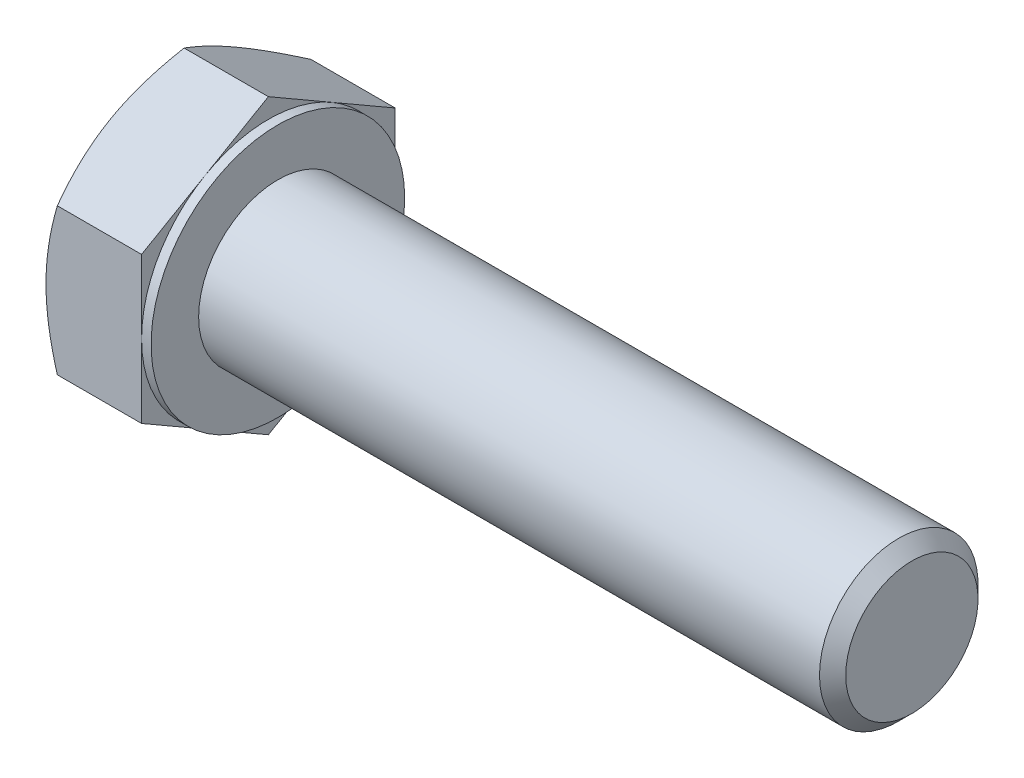
ISO-10303-21;
HEADER;
FILE_DESCRIPTION(('STEP AP214'),'2;1');
FILE_NAME('part.step','',(''),(''),'','','');
FILE_SCHEMA(('AUTOMOTIVE_DESIGN { 1 0 10303 214 1 1 1 1 }'));
ENDSEC;
DATA;
#1=APPLICATION_CONTEXT('core data for automotive mechanical design processes');
#2=APPLICATION_PROTOCOL_DEFINITION('international standard','automotive_design',2000,#1);
#3=PRODUCT_CONTEXT('',#1,'mechanical');
#4=PRODUCT('Part','Part','',(#3));
#5=PRODUCT_RELATED_PRODUCT_CATEGORY('part','',(#4));
#6=PRODUCT_DEFINITION_FORMATION('','',#4);
#7=PRODUCT_DEFINITION_CONTEXT('part definition',#1,'design');
#8=PRODUCT_DEFINITION('design','',#6,#7);
#9=PRODUCT_DEFINITION_SHAPE('','',#8);
#10=(LENGTH_UNIT() NAMED_UNIT(*) SI_UNIT(.MILLI.,.METRE.));
#11=(NAMED_UNIT(*) PLANE_ANGLE_UNIT() SI_UNIT($,.RADIAN.));
#12=(NAMED_UNIT(*) SI_UNIT($,.STERADIAN.) SOLID_ANGLE_UNIT());
#13=UNCERTAINTY_MEASURE_WITH_UNIT(LENGTH_MEASURE(1.E-05),#10,'distance_accuracy_value','');
#14=(GEOMETRIC_REPRESENTATION_CONTEXT(3) GLOBAL_UNCERTAINTY_ASSIGNED_CONTEXT((#13)) GLOBAL_UNIT_ASSIGNED_CONTEXT((#10,
#11,#12)) REPRESENTATION_CONTEXT('',''));
#15=CARTESIAN_POINT('',(0.,0.,0.));
#16=DIRECTION('',(0.,0.,1.));
#17=DIRECTION('',(1.,0.,0.));
#18=AXIS2_PLACEMENT_3D('',#15,#16,#17);
#19=CARTESIAN_POINT('',(6.63,9.23760430703402,0.));
#20=DIRECTION('',(1.,0.,0.));
#21=DIRECTION('',(0.,0.,-1.));
#22=AXIS2_PLACEMENT_3D('',#19,#20,#21);
#23=PLANE('',#22);
#24=CARTESIAN_POINT('',(6.63,0.,0.));
#25=DIRECTION('',(1.,0.,0.));
#26=DIRECTION('',(0.,0.,-1.));
#27=AXIS2_PLACEMENT_3D('',#24,#25,#26);
#28=CIRCLE('',#27,5.);
#29=CARTESIAN_POINT('',(6.63,0.,-5.));
#30=VERTEX_POINT('',#29);
#31=EDGE_CURVE('E280',#30,#30,#28,.F.);
#32=ORIENTED_EDGE('',*,*,#31,.T.);
#33=EDGE_LOOP('',(#32));
#34=FACE_BOUND('',#33,.T.);
#35=CARTESIAN_POINT('',(6.63,0.,0.));
#36=DIRECTION('',(1.,0.,0.));
#37=DIRECTION('',(0.,0.,-1.));
#38=AXIS2_PLACEMENT_3D('',#35,#36,#37);
#39=CIRCLE('',#38,8.);
#40=CARTESIAN_POINT('',(6.63,0.,-8.));
#41=VERTEX_POINT('',#40);
#42=EDGE_CURVE('E299',#41,#41,#39,.T.);
#43=ORIENTED_EDGE('',*,*,#42,.T.);
#44=EDGE_LOOP('',(#43));
#45=FACE_BOUND('',#44,.T.);
#46=ADVANCED_FACE('F36',(#34,#45),#23,.T.);
#47=CARTESIAN_POINT('',(0.,0.,0.));
#48=DIRECTION('',(-1.,0.,0.));
#49=DIRECTION('',(0.,0.,1.));
#50=AXIS2_PLACEMENT_3D('',#47,#48,#49);
#51=CYLINDRICAL_SURFACE('',#50,5.);
#52=ORIENTED_EDGE('',*,*,#31,.F.);
#53=EDGE_LOOP('',(#52));
#54=FACE_BOUND('',#53,.T.);
#55=CARTESIAN_POINT('',(45.802,0.,0.));
#56=DIRECTION('',(-1.,0.,0.));
#57=DIRECTION('',(0.,0.,1.));
#58=AXIS2_PLACEMENT_3D('',#55,#56,#57);
#59=CIRCLE('',#58,5.);
#60=CARTESIAN_POINT('',(45.802,0.,5.));
#61=VERTEX_POINT('',#60);
#62=EDGE_CURVE('E277',#61,#61,#59,.T.);
#63=ORIENTED_EDGE('',*,*,#62,.T.);
#64=EDGE_LOOP('',(#63));
#65=FACE_BOUND('',#64,.T.);
#66=ADVANCED_FACE('F251',(#54,#65),#51,.T.);
#67=CARTESIAN_POINT('',(46.63,0.,0.));
#68=DIRECTION('',(-1.,0.,0.));
#69=DIRECTION('',(0.,0.,1.));
#70=AXIS2_PLACEMENT_3D('',#67,#68,#69);
#71=CONICAL_SURFACE('',#70,4.172,0.785398163397448);
#72=ORIENTED_EDGE('',*,*,#62,.F.);
#73=EDGE_LOOP('',(#72));
#74=FACE_BOUND('',#73,.T.);
#75=CARTESIAN_POINT('',(46.63,0.,0.));
#76=DIRECTION('',(-1.,0.,0.));
#77=DIRECTION('',(0.,0.,1.));
#78=AXIS2_PLACEMENT_3D('',#75,#76,#77);
#79=CIRCLE('',#78,4.172);
#80=CARTESIAN_POINT('',(46.63,0.,4.172));
#81=VERTEX_POINT('',#80);
#82=EDGE_CURVE('E275',#81,#81,#79,.T.);
#83=ORIENTED_EDGE('',*,*,#82,.T.);
#84=EDGE_LOOP('',(#83));
#85=FACE_BOUND('',#84,.T.);
#86=ADVANCED_FACE('F256',(#74,#85),#71,.T.);
#87=CARTESIAN_POINT('',(46.63,0.,0.));
#88=DIRECTION('',(-1.,0.,0.));
#89=DIRECTION('',(0.,0.,1.));
#90=AXIS2_PLACEMENT_3D('',#87,#88,#89);
#91=PLANE('',#90);
#92=ORIENTED_EDGE('',*,*,#82,.F.);
#93=EDGE_LOOP('',(#92));
#94=FACE_BOUND('',#93,.T.);
#95=ADVANCED_FACE('F263',(#94),#91,.F.);
#96=CARTESIAN_POINT('',(6.03,8.,0.));
#97=DIRECTION('',(1.,0.,0.));
#98=DIRECTION('',(0.,0.,-1.));
#99=AXIS2_PLACEMENT_3D('',#96,#97,#98);
#100=PLANE('',#99);
#101=DIRECTION('',(0.,0.500000000000001,0.866025403784438));
#102=VECTOR('',#101,1.);
#103=CARTESIAN_POINT('',(6.03,4.618802153517,-8.));
#104=LINE('',#103,#102);
#105=CARTESIAN_POINT('',(6.03,4.618802153517,-8.));
#106=VERTEX_POINT('',#105);
#107=CARTESIAN_POINT('',(6.03,6.92820323027551,-4.00000000000001));
#108=VERTEX_POINT('',#107);
#109=EDGE_CURVE('E169',#106,#108,#104,.T.);
#110=ORIENTED_EDGE('',*,*,#109,.T.);
#111=CARTESIAN_POINT('',(6.03,0.,0.));
#112=DIRECTION('',(-1.,0.,0.));
#113=DIRECTION('',(0.,0.,1.));
#114=AXIS2_PLACEMENT_3D('',#111,#112,#113);
#115=CIRCLE('',#114,8.);
#116=CARTESIAN_POINT('',(6.03,0.,-8.));
#117=VERTEX_POINT('',#116);
#118=EDGE_CURVE('E52',#108,#117,#115,.T.);
#119=ORIENTED_EDGE('',*,*,#118,.T.);
#120=DIRECTION('',(0.,1.,0.));
#121=VECTOR('',#120,1.);
#122=CARTESIAN_POINT('',(6.03,4.618802153517,-8.));
#123=LINE('',#122,#121);
#124=EDGE_CURVE('E41',#117,#106,#123,.T.);
#125=ORIENTED_EDGE('',*,*,#124,.T.);
#126=EDGE_LOOP('',(#110,#119,#125));
#127=FACE_BOUND('',#126,.T.);
#128=ADVANCED_FACE('F266',(#127),#100,.T.);
#129=CARTESIAN_POINT('',(6.03,9.23760430703402,0.));
#130=VERTEX_POINT('',#129);
#131=EDGE_CURVE('E167',#108,#130,#104,.T.);
#132=ORIENTED_EDGE('',*,*,#131,.T.);
#133=DIRECTION('',(0.,-0.500000000000001,0.866025403784438));
#134=VECTOR('',#133,1.);
#135=CARTESIAN_POINT('',(6.03,9.23760430703402,0.));
#136=LINE('',#135,#134);
#137=CARTESIAN_POINT('',(6.03,6.92820323027551,4.00000000000001));
#138=VERTEX_POINT('',#137);
#139=EDGE_CURVE('E166',#130,#138,#136,.T.);
#140=ORIENTED_EDGE('',*,*,#139,.T.);
#141=EDGE_CURVE('E155',#138,#108,#115,.T.);
#142=ORIENTED_EDGE('',*,*,#141,.T.);
#143=EDGE_LOOP('',(#132,#140,#142));
#144=FACE_BOUND('',#143,.T.);
#145=ADVANCED_FACE('F271',(#144),#100,.T.);
#146=CARTESIAN_POINT('',(6.03,4.618802153517,8.));
#147=VERTEX_POINT('',#146);
#148=EDGE_CURVE('E134',#138,#147,#136,.T.);
#149=ORIENTED_EDGE('',*,*,#148,.T.);
#150=DIRECTION('',(0.,-1.,0.));
#151=VECTOR('',#150,1.);
#152=CARTESIAN_POINT('',(6.03,4.618802153517,8.));
#153=LINE('',#152,#151);
#154=CARTESIAN_POINT('',(6.03,0.,8.));
#155=VERTEX_POINT('',#154);
#156=EDGE_CURVE('E128',#147,#155,#153,.T.);
#157=ORIENTED_EDGE('',*,*,#156,.T.);
#158=EDGE_CURVE('E132',#155,#138,#115,.T.);
#159=ORIENTED_EDGE('',*,*,#158,.T.);
#160=EDGE_LOOP('',(#149,#157,#159));
#161=FACE_BOUND('',#160,.T.);
#162=ADVANCED_FACE('F130',(#161),#100,.T.);
#163=CARTESIAN_POINT('',(6.03,-4.61880215351701,8.));
#164=VERTEX_POINT('',#163);
#165=EDGE_CURVE('E138',#155,#164,#153,.T.);
#166=ORIENTED_EDGE('',*,*,#165,.T.);
#167=DIRECTION('',(0.,-0.500000000000001,-0.866025403784438));
#168=VECTOR('',#167,1.);
#169=CARTESIAN_POINT('',(6.03,-9.23760430703403,0.));
#170=LINE('',#169,#168);
#171=CARTESIAN_POINT('',(6.03,-6.92820323027551,4.00000000000001));
#172=VERTEX_POINT('',#171);
#173=EDGE_CURVE('E145',#164,#172,#170,.T.);
#174=ORIENTED_EDGE('',*,*,#173,.T.);
#175=EDGE_CURVE('E142',#172,#155,#115,.T.);
#176=ORIENTED_EDGE('',*,*,#175,.T.);
#177=EDGE_LOOP('',(#166,#174,#176));
#178=FACE_BOUND('',#177,.T.);
#179=ADVANCED_FACE('F143',(#178),#100,.T.);
#180=CARTESIAN_POINT('',(6.03,-9.23760430703403,0.));
#181=VERTEX_POINT('',#180);
#182=EDGE_CURVE('E161',#172,#181,#170,.T.);
#183=ORIENTED_EDGE('',*,*,#182,.T.);
#184=DIRECTION('',(0.,0.500000000000001,-0.866025403784438));
#185=VECTOR('',#184,1.);
#186=CARTESIAN_POINT('',(6.03,-4.61880215351701,-8.));
#187=LINE('',#186,#185);
#188=CARTESIAN_POINT('',(6.03,-6.92820323027551,-4.));
#189=VERTEX_POINT('',#188);
#190=EDGE_CURVE('E335',#181,#189,#187,.T.);
#191=ORIENTED_EDGE('',*,*,#190,.T.);
#192=EDGE_CURVE('E149',#189,#172,#115,.T.);
#193=ORIENTED_EDGE('',*,*,#192,.T.);
#194=EDGE_LOOP('',(#183,#191,#193));
#195=FACE_BOUND('',#194,.T.);
#196=ADVANCED_FACE('F340',(#195),#100,.T.);
#197=CARTESIAN_POINT('',(6.03,-4.61880215351701,-8.));
#198=VERTEX_POINT('',#197);
#199=EDGE_CURVE('E156',#189,#198,#187,.T.);
#200=ORIENTED_EDGE('',*,*,#199,.T.);
#201=EDGE_CURVE('E11',#198,#117,#123,.T.);
#202=ORIENTED_EDGE('',*,*,#201,.T.);
#203=EDGE_CURVE('E353',#117,#189,#115,.T.);
#204=ORIENTED_EDGE('',*,*,#203,.T.);
#205=EDGE_LOOP('',(#200,#202,#204));
#206=FACE_BOUND('',#205,.T.);
#207=ADVANCED_FACE('F272',(#206),#100,.T.);
#208=CARTESIAN_POINT('',(0.,0.,0.));
#209=DIRECTION('',(-1.,0.,0.));
#210=DIRECTION('',(0.,0.,1.));
#211=AXIS2_PLACEMENT_3D('',#208,#209,#210);
#212=CYLINDRICAL_SURFACE('',#211,8.);
#213=ORIENTED_EDGE('',*,*,#118,.F.);
#214=ORIENTED_EDGE('',*,*,#141,.F.);
#215=ORIENTED_EDGE('',*,*,#158,.F.);
#216=ORIENTED_EDGE('',*,*,#175,.F.);
#217=ORIENTED_EDGE('',*,*,#192,.F.);
#218=ORIENTED_EDGE('',*,*,#203,.F.);
#219=EDGE_LOOP('',(#213,#214,#215,#216,#217,#218));
#220=FACE_BOUND('',#219,.T.);
#221=ORIENTED_EDGE('',*,*,#42,.F.);
#222=EDGE_LOOP('',(#221));
#223=FACE_BOUND('',#222,.T.);
#224=ADVANCED_FACE('F152',(#220,#223),#212,.T.);
#225=CARTESIAN_POINT('',(0.,9.23760430703402,0.));
#226=DIRECTION('',(1.,0.,0.));
#227=DIRECTION('',(0.,0.,-1.));
#228=AXIS2_PLACEMENT_3D('',#225,#226,#227);
#229=PLANE('',#228);
#230=CARTESIAN_POINT('',(0.,0.,0.));
#231=DIRECTION('',(1.,0.,0.));
#232=DIRECTION('',(0.,0.,-1.));
#233=AXIS2_PLACEMENT_3D('',#230,#231,#232);
#234=CIRCLE('',#233,8.);
#235=CARTESIAN_POINT('',(0.,0.,-8.));
#236=VERTEX_POINT('',#235);
#237=CARTESIAN_POINT('',(0.,6.92820323027551,-4.00000000000001));
#238=VERTEX_POINT('',#237);
#239=EDGE_CURVE('E298',#236,#238,#234,.T.);
#240=ORIENTED_EDGE('',*,*,#239,.F.);
#241=CARTESIAN_POINT('',(0.,-6.92820323027551,-4.));
#242=VERTEX_POINT('',#241);
#243=EDGE_CURVE('E295',#242,#236,#234,.T.);
#244=ORIENTED_EDGE('',*,*,#243,.F.);
#245=CARTESIAN_POINT('',(0.,-6.92820323027551,4.00000000000001));
#246=VERTEX_POINT('',#245);
#247=EDGE_CURVE('E297',#246,#242,#234,.T.);
#248=ORIENTED_EDGE('',*,*,#247,.F.);
#249=CARTESIAN_POINT('',(0.,0.,8.));
#250=VERTEX_POINT('',#249);
#251=EDGE_CURVE('E307',#250,#246,#234,.T.);
#252=ORIENTED_EDGE('',*,*,#251,.F.);
#253=CARTESIAN_POINT('',(0.,0.,0.));
#254=DIRECTION('',(-1.,0.,0.));
#255=DIRECTION('',(0.,0.,1.));
#256=AXIS2_PLACEMENT_3D('',#253,#254,#255);
#257=CIRCLE('',#256,8.);
#258=CARTESIAN_POINT('',(0.,6.9282032302755,4.00000000000001));
#259=VERTEX_POINT('',#258);
#260=EDGE_CURVE('E170',#250,#259,#257,.T.);
#261=ORIENTED_EDGE('',*,*,#260,.T.);
#262=EDGE_CURVE('E302',#238,#259,#234,.T.);
#263=ORIENTED_EDGE('',*,*,#262,.F.);
#264=EDGE_LOOP('',(#240,#244,#248,#252,#261,#263));
#265=FACE_BOUND('',#264,.T.);
#266=ADVANCED_FACE('F201',(#265),#229,.F.);
#267=CARTESIAN_POINT('',(0.,0.,0.));
#268=DIRECTION('',(1.,0.,0.));
#269=DIRECTION('',(0.,0.,-1.));
#270=AXIS2_PLACEMENT_3D('',#267,#268,#269);
#271=CONICAL_SURFACE('',#270,8.,1.0471975511966);
#272=CARTESIAN_POINT('',(0.714597847732973,4.61868668346316,8.0002));
#273=CARTESIAN_POINT('',(0.655990714047297,4.72021302617289,7.8243512161201));
#274=CARTESIAN_POINT('',(0.60004340104729,4.82211789504564,7.64784680569386));
#275=CARTESIAN_POINT('',(0.494201005024666,5.02675523421805,7.29340453712154));
#276=CARTESIAN_POINT('',(0.444308534431066,5.12948804149869,7.11546609530729));
#277=CARTESIAN_POINT('',(0.304692797206866,5.43933133858026,6.57880176237736));
#278=CARTESIAN_POINT('',(0.225281170978369,5.64766491807818,6.21795741776428));
#279=CARTESIAN_POINT('',(0.132161646294488,5.95943209350317,5.67796082979595));
#280=CARTESIAN_POINT('',(0.105634581029124,6.06193429416807,5.50042181035672));
#281=CARTESIAN_POINT('',(0.061153174858875,6.26740224104455,5.1445408870398));
#282=CARTESIAN_POINT('',(0.0431980765145795,6.37036794548792,4.96619905550676));
#283=CARTESIAN_POINT('',(0.0163156484918648,6.57647664551585,4.60920831517641));
#284=CARTESIAN_POINT('',(0.00737807354623306,6.67961930623067,4.4305599863905));
#285=CARTESIAN_POINT('',(-0.0012776960348698,6.88599991003618,4.07309829490262));
#286=CARTESIAN_POINT('',(-0.000996175497149585,6.98923785008464,3.89428493746994));
#287=CARTESIAN_POINT('',(0.00814502526877654,7.18224506616975,3.5599866329831));
#288=CARTESIAN_POINT('',(0.0158896043673707,7.27202796205376,3.40447809566133));
#289=CARTESIAN_POINT('',(0.0382011348534295,7.45138347289924,3.09382523825949));
#290=CARTESIAN_POINT('',(0.0527685461381487,7.54095607327651,2.93868094344));
#291=CARTESIAN_POINT('',(0.106360690527537,7.80932710333149,2.47384868410519));
#292=CARTESIAN_POINT('',(0.155268641669144,7.98765049311728,2.16498351281828));
#293=CARTESIAN_POINT('',(0.277539403234314,8.34618890253625,1.5439767712397));
#294=CARTESIAN_POINT('',(0.351420520376,8.52635816315522,1.23191445788552));
#295=CARTESIAN_POINT('',(0.519100141254974,8.88400987687705,0.612443518305242));
#296=CARTESIAN_POINT('',(0.612859260854458,9.06149691008278,0.30502695910825));
#297=CARTESIAN_POINT('',(0.714597847732978,9.23771977708786,-0.0002000000000001));
#298=B_SPLINE_CURVE_WITH_KNOTS('',3,(#272,#273,#274,#275,#276,#277,#278,#279,#280,#281,#282,
#283,#284,#285,#286,#287,#288,#289,#290,#291,#292,#293,#294,#295,#296,#297),.UNSPECIFIED.,.F.,
.F.,(4,2,2,2,2,2,2,2,2,2,2,2,4),(0.,0.63397354372135,1.26821965714356,2.53934712434766,
3.15934343977049,3.77928496069784,4.39852133866766,5.01773858515595,5.55680239410249,
6.09590254421147,7.17487077411835,8.27776850154293,9.37850115249055),.UNSPECIFIED.);
#299=CARTESIAN_POINT('',(0.714531179816327,9.23760430703402,0.));
#300=VERTEX_POINT('',#299);
#301=EDGE_CURVE('E220',#259,#300,#298,.T.);
#302=ORIENTED_EDGE('',*,*,#301,.T.);
#303=CARTESIAN_POINT('',(0.714597847732979,9.23771977708786,0.0002));
#304=CARTESIAN_POINT('',(0.655990714047303,9.13619343437813,-0.175648783879896));
#305=CARTESIAN_POINT('',(0.600043401047295,9.03428856550538,-0.352153194306135));
#306=CARTESIAN_POINT('',(0.494201005024671,8.82965122633297,-0.70659546287846));
#307=CARTESIAN_POINT('',(0.444308534431071,8.72691841905233,-0.884533904692712));
#308=CARTESIAN_POINT('',(0.30469279720687,8.41707512197076,-1.42119823762264));
#309=CARTESIAN_POINT('',(0.225281170978371,8.20874154247285,-1.78204258223572));
#310=CARTESIAN_POINT('',(0.132161646294491,7.89697436704785,-2.32203917020405));
#311=CARTESIAN_POINT('',(0.105634581029126,7.79447216638295,-2.49957818964329));
#312=CARTESIAN_POINT('',(0.0611531748588776,7.58900421950647,-2.8554591129602));
#313=CARTESIAN_POINT('',(0.0431980765145813,7.4860385150631,-3.03380094449324));
#314=CARTESIAN_POINT('',(0.0163156484918661,7.27992981503517,-3.3907916848236));
#315=CARTESIAN_POINT('',(0.00737807354623461,7.17678715432035,-3.5694400136095));
#316=CARTESIAN_POINT('',(-0.00127769603486937,6.97040655051484,-3.92690170509738));
#317=CARTESIAN_POINT('',(-0.000996175497150483,6.86716861046638,-4.10571506253007));
#318=CARTESIAN_POINT('',(0.00814502526877518,6.67416139438127,-4.44001336701691));
#319=CARTESIAN_POINT('',(0.0158896043673699,6.58437849849726,-4.59552190433867));
#320=CARTESIAN_POINT('',(0.0382011348534286,6.40502298765178,-4.90617476174051));
#321=CARTESIAN_POINT('',(0.0527685461381473,6.31545038727451,-5.06131905656));
#322=CARTESIAN_POINT('',(0.106360690527535,6.04707935721953,-5.52615131589482));
#323=CARTESIAN_POINT('',(0.155268641669142,5.86875596743374,-5.83501648718172));
#324=CARTESIAN_POINT('',(0.277539403234311,5.51021755801478,-6.4560232287603));
#325=CARTESIAN_POINT('',(0.351420520375997,5.3300482973958,-6.76808554211448));
#326=CARTESIAN_POINT('',(0.51910014125497,4.97239658367398,-7.38755648169476));
#327=CARTESIAN_POINT('',(0.612859260854453,4.79490955046824,-7.69497304089175));
#328=CARTESIAN_POINT('',(0.714597847732973,4.61868668346316,-8.0002));
#329=B_SPLINE_CURVE_WITH_KNOTS('',3,(#303,#304,#305,#306,#307,#308,#309,#310,#311,#312,#313,
#314,#315,#316,#317,#318,#319,#320,#321,#322,#323,#324,#325,#326,#327,#328),.UNSPECIFIED.,.F.,
.F.,(4,2,2,2,2,2,2,2,2,2,2,2,4),(0.,0.633973543721351,1.26821965714356,2.53934712434766,
3.15934343977049,3.77928496069784,4.39852133866766,5.01773858515596,5.55680239410249,
6.09590254421148,7.17487077411835,8.27776850154293,9.37850115249055),.UNSPECIFIED.);
#330=EDGE_CURVE('E60',#300,#238,#329,.T.);
#331=ORIENTED_EDGE('',*,*,#330,.T.);
#332=ORIENTED_EDGE('',*,*,#262,.T.);
#333=EDGE_LOOP('',(#302,#331,#332));
#334=FACE_BOUND('',#333,.T.);
#335=ADVANCED_FACE('F349',(#334),#271,.T.);
#336=CARTESIAN_POINT('',(4.0249059167733,-12.6546855991449,8.));
#337=CARTESIAN_POINT('',(3.85338488067433,-12.3031246943084,8.));
#338=CARTESIAN_POINT('',(3.6834382004866,-11.9507829330126,8.));
#339=CARTESIAN_POINT('',(3.34757428373754,-11.2441233421334,8.));
#340=CARTESIAN_POINT('',(3.18165763687251,-10.8898052325765,8.));
#341=CARTESIAN_POINT('',(2.8539519485588,-10.177068949224,8.));
#342=CARTESIAN_POINT('',(2.69218825446259,-9.81863908249931,8.));
#343=CARTESIAN_POINT('',(2.37495727163404,-9.09901413787101,8.));
#344=CARTESIAN_POINT('',(2.21948970117941,-8.73781918455396,8.));
#345=CARTESIAN_POINT('',(1.911249099453,-7.99950052196692,8.));
#346=CARTESIAN_POINT('',(1.75875676876379,-7.62225899821522,8.));
#347=CARTESIAN_POINT('',(1.46472411543647,-6.86345577325908,8.));
#348=CARTESIAN_POINT('',(1.32318498677801,-6.48189360625494,8.));
#349=CARTESIAN_POINT('',(1.0545943266276,-5.71447512846895,8.));
#350=CARTESIAN_POINT('',(0.927515477435015,-5.32862847865213,8.));
#351=CARTESIAN_POINT('',(0.69175721197265,-4.55141880683298,8.));
#352=CARTESIAN_POINT('',(0.583072255498525,-4.16005748444889,8.));
#353=CARTESIAN_POINT('',(0.38975037705901,-3.37376378378106,8.));
#354=CARTESIAN_POINT('',(0.30497372409415,-2.97886668689222,8.));
#355=CARTESIAN_POINT('',(0.19927520003407,-2.38273452721077,8.));
#356=CARTESIAN_POINT('',(0.167618755452532,-2.18337977546989,8.));
#357=CARTESIAN_POINT('',(0.112075358367338,-1.78359737346043,8.));
#358=CARTESIAN_POINT('',(0.0881876497104349,-1.58316982954116,8.));
#359=CARTESIAN_POINT('',(0.048970697402874,-1.18423541636502,8.));
#360=CARTESIAN_POINT('',(0.0335291727837695,-0.985739633099701,8.));
#361=CARTESIAN_POINT('',(0.011062971420028,-0.588272081696584,8.));
#362=CARTESIAN_POINT('',(0.00403814809138642,-0.389300321908793,8.));
#363=CARTESIAN_POINT('',(-0.00142584062308302,0.00876221739738226,8.));
#364=CARTESIAN_POINT('',(0.000134957775689094,0.207852996410185,8.));
#365=CARTESIAN_POINT('',(0.0118014221261086,0.605786210981723,8.));
#366=CARTESIAN_POINT('',(0.0219074678573634,0.804628635109369,8.));
#367=CARTESIAN_POINT('',(0.0557165381587494,1.27520492278816,8.));
#368=CARTESIAN_POINT('',(0.0830672705335621,1.54668292394839,8.));
#369=CARTESIAN_POINT('',(0.152259239797329,2.08777093274817,8.));
#370=CARTESIAN_POINT('',(0.194102245476499,2.35738070827078,8.));
#371=CARTESIAN_POINT('',(0.339163191030428,3.16301775718137,8.));
#372=CARTESIAN_POINT('',(0.461891297316743,3.6955868926657,8.));
#373=CARTESIAN_POINT('',(0.676586598475546,4.49226054421557,8.));
#374=CARTESIAN_POINT('',(0.754301853574808,4.76044513184217,8.));
#375=CARTESIAN_POINT('',(0.918275620129024,5.29421545251858,8.));
#376=CARTESIAN_POINT('',(1.00453419425134,5.5598011664893,8.));
#377=CARTESIAN_POINT('',(1.18417203692079,6.08844838170895,8.));
#378=CARTESIAN_POINT('',(1.27754932022058,6.35151056384122,8.));
#379=CARTESIAN_POINT('',(1.47027925064866,6.87542422157423,8.));
#380=CARTESIAN_POINT('',(1.5696317881954,7.13627573761683,8.));
#381=CARTESIAN_POINT('',(1.83061788769923,7.80218876251026,8.));
#382=CARTESIAN_POINT('',(1.99585031155407,8.20583801515886,8.));
#383=CARTESIAN_POINT('',(2.33560644018457,9.0092209168922,8.));
#384=CARTESIAN_POINT('',(2.510130999083,9.40895420201323,8.));
#385=CARTESIAN_POINT('',(2.86641485367069,10.2053302526422,8.));
#386=CARTESIAN_POINT('',(3.04817649814071,10.6019719640146,8.));
#387=CARTESIAN_POINT('',(3.41731475401143,11.3926098784745,8.));
#388=CARTESIAN_POINT('',(3.60469118042222,11.7866061681983,8.));
#389=CARTESIAN_POINT('',(3.98417977419137,12.5730081393898,8.));
#390=CARTESIAN_POINT('',(4.17629838528329,12.9654107050659,8.));
#391=CARTESIAN_POINT('',(4.56413461314098,13.7484335721844,8.));
#392=CARTESIAN_POINT('',(4.75985225388509,14.1390538617309,8.));
#393=CARTESIAN_POINT('',(5.15417791142117,14.9187387057041,8.));
#394=CARTESIAN_POINT('',(5.35278537700422,15.3078035392312,8.));
#395=CARTESIAN_POINT('',(5.75241278006942,16.0846929572358,8.));
#396=CARTESIAN_POINT('',(5.95343272769671,16.4725175364891,8.));
#397=CARTESIAN_POINT('',(6.5202315836378,17.559169962925,8.));
#398=CARTESIAN_POINT('',(6.88826669822291,18.2568208048589,7.99999999999999));
#399=CARTESIAN_POINT('',(7.62911646383156,19.6496204545043,7.99999999999999));
#400=CARTESIAN_POINT('',(8.00193136222298,20.3447691303174,7.99999999999999));
#401=CARTESIAN_POINT('',(8.74998840854047,21.7309493550891,7.99999999999999));
#402=CARTESIAN_POINT('',(9.12521930468555,22.4219869802512,7.99999999999999));
#403=CARTESIAN_POINT('',(9.69012626360779,23.4573861860725,7.99999999999999));
#404=CARTESIAN_POINT('',(9.8787653796288,23.8023143286788,7.99999999999999));
#405=CARTESIAN_POINT('',(10.2566598347554,24.4918322089549,7.99999999999999));
#406=CARTESIAN_POINT('',(10.4459151728861,24.836421947159,7.99999999999999));
#407=CARTESIAN_POINT('',(10.6354414476718,25.1808626447394,7.99999999999999));
#408=B_SPLINE_CURVE_WITH_KNOTS('',3,(#336,#337,#338,#339,#340,#341,#342,#343,#344,#345,#346,
#347,#348,#349,#350,#351,#352,#353,#354,#355,#356,#357,#358,#359,#360,#361,#362,#363,#364,#365,
#366,#367,#368,#369,#370,#371,#372,#373,#374,#375,#376,#377,#378,#379,#380,#381,#382,#383,#384,
#385,#386,#387,#388,#389,#390,#391,#392,#393,#394,#395,#396,#397,#398,#399,#400,#401,#402,#403,
#404,#405,#406,#407),.UNSPECIFIED.,.F.,.F.,(4,2,2,2,2,2,2,2,2,2,2,2,2,2,2,2,2,2,2,2,2,2,2,2,2,2,
2,2,2,2,2,2,2,2,2,4),(0.,1.17352534459167,2.34722138373236,3.52689945532928,4.70652468335868,
5.92708318027306,7.14777454017932,8.36612013432257,9.5840981095466,10.7948027291759,
11.40023293749,12.0056041999049,12.6027191320313,13.1998236647426,13.7969256787822,
14.3940542314437,15.2121538551722,16.0303533636327,17.6675489933806,18.5051258944523,
19.3427089398139,20.180059250671,21.0173942098501,22.3257038658076,23.6341339884584,
24.9429922771239,26.2518074902209,27.5625113934848,28.8732240324076,30.1836898590194,
31.4941611984269,33.8604586198774,36.2268790025322,38.5858914656951,39.7653151283338,
40.9447369260388),.UNSPECIFIED.);
#409=CARTESIAN_POINT('',(0.714531179816321,4.618802153517,8.));
#410=VERTEX_POINT('',#409);
#411=EDGE_CURVE('E234',#250,#410,#408,.T.);
#412=ORIENTED_EDGE('',*,*,#411,.T.);
#413=EDGE_CURVE('E233',#410,#259,#298,.T.);
#414=ORIENTED_EDGE('',*,*,#413,.T.);
#415=ORIENTED_EDGE('',*,*,#260,.F.);
#416=EDGE_LOOP('',(#412,#414,#415));
#417=FACE_BOUND('',#416,.T.);
#418=ADVANCED_FACE('F345',(#417),#271,.T.);
#419=CARTESIAN_POINT('',(0.714531179816324,-4.61880215351701,8.));
#420=VERTEX_POINT('',#419);
#421=EDGE_CURVE('E278',#420,#250,#408,.T.);
#422=ORIENTED_EDGE('',*,*,#421,.T.);
#423=ORIENTED_EDGE('',*,*,#251,.T.);
#424=CARTESIAN_POINT('',(0.714597847732982,-9.23771977708786,-0.000200000000000075));
#425=CARTESIAN_POINT('',(0.655990714047307,-9.13619343437814,0.175648783879896));
#426=CARTESIAN_POINT('',(0.600043401047299,-9.03428856550539,0.352153194306135));
#427=CARTESIAN_POINT('',(0.494201005024675,-8.82965122633298,0.706595462878461));
#428=CARTESIAN_POINT('',(0.444308534431075,-8.72691841905234,0.884533904692713));
#429=CARTESIAN_POINT('',(0.304692797206873,-8.41707512197077,1.42119823762265));
#430=CARTESIAN_POINT('',(0.225281170978374,-8.20874154247285,1.78204258223573));
#431=CARTESIAN_POINT('',(0.132161646294494,-7.89697436704786,2.32203917020405));
#432=CARTESIAN_POINT('',(0.10563458102913,-7.79447216638295,2.49957818964329));
#433=CARTESIAN_POINT('',(0.0611531748588812,-7.58900421950648,2.8554591129602));
#434=CARTESIAN_POINT('',(0.0431980765145852,-7.48603851506311,3.03380094449324));
#435=CARTESIAN_POINT('',(0.0163156484918699,-7.27992981503517,3.3907916848236));
#436=CARTESIAN_POINT('',(0.00737807354623799,-7.17678715432035,3.56944001360951));
#437=CARTESIAN_POINT('',(-0.00127769603486573,-6.97040655051484,3.92690170509739));
#438=CARTESIAN_POINT('',(-0.000996175497146175,-6.86716861046638,4.10571506253007));
#439=CARTESIAN_POINT('',(0.00814502526877916,-6.67416139438127,4.44001336701691));
#440=CARTESIAN_POINT('',(0.0158896043673731,-6.58437849849726,4.59552190433868));
#441=CARTESIAN_POINT('',(0.0382011348534317,-6.40502298765179,4.90617476174052));
#442=CARTESIAN_POINT('',(0.0527685461381509,-6.31545038727452,5.06131905656));
#443=CARTESIAN_POINT('',(0.106360690527539,-6.04707935721954,5.52615131589482));
#444=CARTESIAN_POINT('',(0.155268641669146,-5.86875596743375,5.83501648718172));
#445=CARTESIAN_POINT('',(0.277539403234314,-5.51021755801478,6.4560232287603));
#446=CARTESIAN_POINT('',(0.351420520375999,-5.33004829739581,6.76808554211448));
#447=CARTESIAN_POINT('',(0.519100141254971,-4.97239658367398,7.38755648169476));
#448=CARTESIAN_POINT('',(0.612859260854455,-4.79490955046825,7.69497304089175));
#449=CARTESIAN_POINT('',(0.714597847732975,-4.61868668346317,8.0002));
#450=B_SPLINE_CURVE_WITH_KNOTS('',3,(#424,#425,#426,#427,#428,#429,#430,#431,#432,#433,#434,
#435,#436,#437,#438,#439,#440,#441,#442,#443,#444,#445,#446,#447,#448,#449),.UNSPECIFIED.,.F.,
.F.,(4,2,2,2,2,2,2,2,2,2,2,2,4),(0.,0.633973543721352,1.26821965714356,2.53934712434766,
3.15934343977049,3.77928496069784,4.39852133866767,5.01773858515596,5.5568023941025,
6.09590254421149,7.17487077411835,8.27776850154293,9.37850115249055),.UNSPECIFIED.);
#451=EDGE_CURVE('E222',#246,#420,#450,.T.);
#452=ORIENTED_EDGE('',*,*,#451,.T.);
#453=EDGE_LOOP('',(#422,#423,#452));
#454=FACE_BOUND('',#453,.T.);
#455=ADVANCED_FACE('F190',(#454),#271,.T.);
#456=CARTESIAN_POINT('',(0.714531179816331,-9.23760430703403,0.));
#457=VERTEX_POINT('',#456);
#458=EDGE_CURVE('E214',#457,#246,#450,.T.);
#459=ORIENTED_EDGE('',*,*,#458,.T.);
#460=ORIENTED_EDGE('',*,*,#247,.T.);
#461=CARTESIAN_POINT('',(0.714597847732977,-4.61868668346318,-8.0002));
#462=CARTESIAN_POINT('',(0.655990714047301,-4.7202130261729,-7.8243512161201));
#463=CARTESIAN_POINT('',(0.600043401047293,-4.82211789504565,-7.64784680569387));
#464=CARTESIAN_POINT('',(0.49420100502467,-5.02675523421806,-7.29340453712154));
#465=CARTESIAN_POINT('',(0.44430853443107,-5.1294880414987,-7.11546609530729));
#466=CARTESIAN_POINT('',(0.304692797206871,-5.43933133858027,-6.57880176237736));
#467=CARTESIAN_POINT('',(0.225281170978372,-5.64766491807818,-6.21795741776428));
#468=CARTESIAN_POINT('',(0.132161646294493,-5.95943209350318,-5.67796082979595));
#469=CARTESIAN_POINT('',(0.105634581029129,-6.06193429416808,-5.50042181035671));
#470=CARTESIAN_POINT('',(0.0611531748588803,-6.26740224104456,-5.1445408870398));
#471=CARTESIAN_POINT('',(0.0431980765145842,-6.37036794548793,-4.96619905550676));
#472=CARTESIAN_POINT('',(0.0163156484918691,-6.57647664551586,-4.60920831517641));
#473=CARTESIAN_POINT('',(0.00737807354623747,-6.67961930623068,-4.4305599863905));
#474=CARTESIAN_POINT('',(-0.00127769603486548,-6.88599991003619,-4.07309829490262));
#475=CARTESIAN_POINT('',(-0.000996175497145387,-6.98923785008465,-3.89428493746993));
#476=CARTESIAN_POINT('',(0.00814502526878082,-7.18224506616976,-3.55998663298309));
#477=CARTESIAN_POINT('',(0.0158896043673751,-7.27202796205377,-3.40447809566133));
#478=CARTESIAN_POINT('',(0.0382011348534337,-7.45138347289925,-3.09382523825949));
#479=CARTESIAN_POINT('',(0.0527685461381526,-7.54095607327652,-2.93868094344));
#480=CARTESIAN_POINT('',(0.106360690527541,-7.8093271033315,-2.47384868410518));
#481=CARTESIAN_POINT('',(0.155268641669149,-7.98765049311729,-2.16498351281828));
#482=CARTESIAN_POINT('',(0.277539403234319,-8.34618890253626,-1.5439767712397));
#483=CARTESIAN_POINT('',(0.351420520376005,-8.52635816315523,-1.23191445788552));
#484=CARTESIAN_POINT('',(0.519100141254977,-8.88400987687705,-0.612443518305239));
#485=CARTESIAN_POINT('',(0.612859260854461,-9.06149691008279,-0.305026959108248));
#486=CARTESIAN_POINT('',(0.714597847732982,-9.23771977708786,0.000200000000001359));
#487=B_SPLINE_CURVE_WITH_KNOTS('',3,(#461,#462,#463,#464,#465,#466,#467,#468,#469,#470,#471,
#472,#473,#474,#475,#476,#477,#478,#479,#480,#481,#482,#483,#484,#485,#486),.UNSPECIFIED.,.F.,
.F.,(4,2,2,2,2,2,2,2,2,2,2,2,4),(0.,0.63397354372135,1.26821965714356,2.53934712434766,
3.15934343977049,3.77928496069784,4.39852133866766,5.01773858515595,5.55680239410249,
6.09590254421148,7.17487077411835,8.27776850154293,9.37850115249055),.UNSPECIFIED.);
#488=EDGE_CURVE('E221',#242,#457,#487,.T.);
#489=ORIENTED_EDGE('',*,*,#488,.T.);
#490=EDGE_LOOP('',(#459,#460,#489));
#491=FACE_BOUND('',#490,.T.);
#492=ADVANCED_FACE('F316',(#491),#271,.T.);
#493=CARTESIAN_POINT('',(0.714531179816322,4.618802153517,-8.));
#494=VERTEX_POINT('',#493);
#495=EDGE_CURVE('E223',#238,#494,#329,.T.);
#496=ORIENTED_EDGE('',*,*,#495,.T.);
#497=CARTESIAN_POINT('',(4.02490590955892,-12.6546855843617,-8.));
#498=CARTESIAN_POINT('',(3.85338487375994,-12.3031246800229,-8.));
#499=CARTESIAN_POINT('',(3.68343819387203,-11.9507829192251,-8.));
#500=CARTESIAN_POINT('',(3.34757427772118,-11.2441233293434,-8.));
#501=CARTESIAN_POINT('',(3.18165763115452,-10.889805220286,-8.));
#502=CARTESIAN_POINT('',(2.85395194343769,-10.1770689379399,-8.));
#503=CARTESIAN_POINT('',(2.69218824963993,-9.81863907172212,-8.));
#504=CARTESIAN_POINT('',(2.37495726740341,-9.09901412811101,-8.));
#505=CARTESIAN_POINT('',(2.21948969724236,-8.73781917530424,-8.));
#506=CARTESIAN_POINT('',(1.91124909611308,-7.99950051377997,-8.));
#507=CARTESIAN_POINT('',(1.75875676572668,-7.62225899058113,-8.));
#508=CARTESIAN_POINT('',(1.46472411298911,-6.86345576673944,-8.));
#509=CARTESIAN_POINT('',(1.32318498461758,-6.4818936002969,-8.));
#510=CARTESIAN_POINT('',(1.05459432501409,-5.71447512364446,-8.));
#511=CARTESIAN_POINT('',(0.927515476081571,-5.32862847439956,-8.));
#512=CARTESIAN_POINT('',(0.691757211097752,-4.55141880373958,-8.));
#513=CARTESIAN_POINT('',(0.583072254842124,-4.16005748194274,-8.));
#514=CARTESIAN_POINT('',(0.389750376844226,-3.37376378274521,-8.));
#515=CARTESIAN_POINT('',(0.304973724086281,-2.9788666867435,-8.));
#516=CARTESIAN_POINT('',(0.199275200237233,-2.38273452840883,-8.));
#517=CARTESIAN_POINT('',(0.167618755709464,-2.1833797771194,-8.));
#518=CARTESIAN_POINT('',(0.112075358694777,-1.78359737601686,-8.));
#519=CARTESIAN_POINT('',(0.0881876500546196,-1.58316983255305,-8.));
#520=CARTESIAN_POINT('',(0.0489706977401185,-1.18423542027826,-8.));
#521=CARTESIAN_POINT('',(0.0335291730980862,-0.985739637458773,-8.));
#522=CARTESIAN_POINT('',(0.0110629716488643,-0.588272086946687,-8.));
#523=CARTESIAN_POINT('',(0.00403814825767111,-0.389300327604098,-8.));
#524=CARTESIAN_POINT('',(-0.00142584062082072,0.008762210814832,-8.));
#525=CARTESIAN_POINT('',(0.000134957676475119,0.207852989385591,-8.));
#526=CARTESIAN_POINT('',(0.0118014217876193,0.605786203078673,-8.));
#527=CARTESIAN_POINT('',(0.0219074673810715,0.804628626769909,-8.));
#528=CARTESIAN_POINT('',(0.0557165373437159,1.27520491378392,-8.));
#529=CARTESIAN_POINT('',(0.0830672695242071,1.54668291471763,-8.));
#530=CARTESIAN_POINT('',(0.152259238389069,2.08777092307491,-8.));
#531=CARTESIAN_POINT('',(0.194102243863653,2.35738069838155,-8.));
#532=CARTESIAN_POINT('',(0.339163188799738,3.16301774665637,-8.));
#533=CARTESIAN_POINT('',(0.461891294668971,3.69558688173416,-8.));
#534=CARTESIAN_POINT('',(0.676586595213053,4.49226053267629,-8.));
#535=CARTESIAN_POINT('',(0.754301850106122,4.76044512009592,-8.));
#536=CARTESIAN_POINT('',(0.918275616254526,5.29421544036084,-8.));
#537=CARTESIAN_POINT('',(1.00453419017723,5.55980115412704,-8.));
#538=CARTESIAN_POINT('',(1.18417203245488,6.08844836893927,-8.));
#539=CARTESIAN_POINT('',(1.2775493155625,6.35151055086863,-8.));
#540=CARTESIAN_POINT('',(1.47027924561321,6.87542420819579,-8.));
#541=CARTESIAN_POINT('',(1.56963178297475,7.13627572403547,-8.));
#542=CARTESIAN_POINT('',(1.830617882168,7.80218874880572,-8.));
#543=CARTESIAN_POINT('',(1.99585030591403,8.20583800152899,-8.));
#544=CARTESIAN_POINT('',(2.33560643435573,9.00922090340244,-8.));
#545=CARTESIAN_POINT('',(2.5101309931742,9.4089541885889,-8.));
#546=CARTESIAN_POINT('',(2.86641484762337,10.2053302393418,-8.));
#547=CARTESIAN_POINT('',(3.04817649203488,10.6019719507727,-8.));
#548=CARTESIAN_POINT('',(3.41731474780413,11.3926098653434,-8.));
#549=CARTESIAN_POINT('',(3.60469117417196,11.7866061551194,-8.));
#550=CARTESIAN_POINT('',(3.98417976786821,12.5730081264133,-8.));
#551=CARTESIAN_POINT('',(4.17629837893025,12.9654106921397,-8.));
#552=CARTESIAN_POINT('',(4.56413460673707,13.7484335593548,-8.));
#553=CARTESIAN_POINT('',(4.75985224746019,14.1390538489476,-8.));
#554=CARTESIAN_POINT('',(5.15417790496087,14.9187386930099,-8.));
#555=CARTESIAN_POINT('',(5.3527853705295,15.3078035265797,-8.));
#556=CARTESIAN_POINT('',(5.75241277357116,16.0846929446672,-8.));
#557=CARTESIAN_POINT('',(5.95343272118932,16.4725175239607,-8.));
#558=CARTESIAN_POINT('',(6.52023157707933,17.5591699504467,-8.));
#559=CARTESIAN_POINT('',(6.8882666916266,18.2568207923884,-8.));
#560=CARTESIAN_POINT('',(7.62911645716788,19.6496204420456,-8.));
#561=CARTESIAN_POINT('',(8.00193135552977,20.3447691178627,-8.));
#562=CARTESIAN_POINT('',(8.74998840178782,21.7309493426279,-8.));
#563=CARTESIAN_POINT('',(9.12521929790291,22.4219869677796,-8.));
#564=CARTESIAN_POINT('',(9.69012625678306,23.4573861735835,-8.));
#565=CARTESIAN_POINT('',(9.87876537279048,23.8023143161837,-8.));
#566=CARTESIAN_POINT('',(10.2566598278908,24.4918321964471,-8.));
#567=CARTESIAN_POINT('',(10.4459151660088,24.8364219346447,-8.));
#568=CARTESIAN_POINT('',(10.635441440782,25.1808626322183,-8.));
#569=B_SPLINE_CURVE_WITH_KNOTS('',3,(#497,#498,#499,#500,#501,#502,#503,#504,#505,#506,#507,
#508,#509,#510,#511,#512,#513,#514,#515,#516,#517,#518,#519,#520,#521,#522,#523,#524,#525,#526,
#527,#528,#529,#530,#531,#532,#533,#534,#535,#536,#537,#538,#539,#540,#541,#542,#543,#544,#545,
#546,#547,#548,#549,#550,#551,#552,#553,#554,#555,#556,#557,#558,#559,#560,#561,#562,#563,#564,
#565,#566,#567,#568),.UNSPECIFIED.,.F.,.F.,(4,2,2,2,2,2,2,2,2,2,2,2,2,2,2,2,2,2,2,2,2,2,2,2,2,2,
2,2,2,2,2,2,2,2,2,4),(0.,1.1735253428552,2.34722138025917,3.52689945010167,4.70652467637677,
5.92708317141316,7.1477745294408,8.36612012171134,9.5840980950641,10.7948027119676,
11.4002329189197,12.0056041799731,12.6027191107726,13.1998236421571,13.7969256548694,
14.3940542062034,15.2121538291978,16.0303533369241,17.6675489652002,18.5051258655031,
19.3427089100958,20.1800592201862,21.0173941785985,22.3257038346386,23.6341339573728,
24.9429922461244,26.2518074593073,27.5625113626671,28.8732240016859,30.1836898283922,
31.4941611678941,33.8604585893125,36.2268789719357,38.5858914350283,39.7653150976312,
40.9447368953006),.UNSPECIFIED.);
#570=EDGE_CURVE('E182',#494,#236,#569,.F.);
#571=ORIENTED_EDGE('',*,*,#570,.T.);
#572=ORIENTED_EDGE('',*,*,#239,.T.);
#573=EDGE_LOOP('',(#496,#571,#572));
#574=FACE_BOUND('',#573,.T.);
#575=ADVANCED_FACE('F330',(#574),#271,.T.);
#576=CARTESIAN_POINT('',(0.714531179816161,-4.61880215351726,-8.));
#577=VERTEX_POINT('',#576);
#578=EDGE_CURVE('E183',#577,#242,#487,.T.);
#579=ORIENTED_EDGE('',*,*,#578,.T.);
#580=ORIENTED_EDGE('',*,*,#243,.T.);
#581=EDGE_CURVE('E173',#236,#577,#569,.F.);
#582=ORIENTED_EDGE('',*,*,#581,.T.);
#583=EDGE_LOOP('',(#579,#580,#582));
#584=FACE_BOUND('',#583,.T.);
#585=ADVANCED_FACE('F199',(#584),#271,.T.);
#586=CARTESIAN_POINT('',(6.63,4.618802153517,-8.));
#587=DIRECTION('',(0.,0.,1.));
#588=DIRECTION('',(1.,0.,0.));
#589=AXIS2_PLACEMENT_3D('',#586,#587,#588);
#590=PLANE('',#589);
#591=ORIENTED_EDGE('',*,*,#201,.F.);
#592=DIRECTION('',(-1.,0.,0.));
#593=VECTOR('',#592,1.);
#594=CARTESIAN_POINT('',(6.63,-4.61880215351701,-8.));
#595=LINE('',#594,#593);
#596=EDGE_CURVE('E286',#198,#577,#595,.T.);
#597=ORIENTED_EDGE('',*,*,#596,.T.);
#598=ORIENTED_EDGE('',*,*,#581,.F.);
#599=ORIENTED_EDGE('',*,*,#570,.F.);
#600=DIRECTION('',(-1.,0.,0.));
#601=VECTOR('',#600,1.);
#602=CARTESIAN_POINT('',(6.63,4.618802153517,-8.));
#603=LINE('',#602,#601);
#604=EDGE_CURVE('E284',#106,#494,#603,.T.);
#605=ORIENTED_EDGE('',*,*,#604,.F.);
#606=ORIENTED_EDGE('',*,*,#124,.F.);
#607=EDGE_LOOP('',(#591,#597,#598,#599,#605,#606));
#608=FACE_BOUND('',#607,.T.);
#609=ADVANCED_FACE('F194',(#608),#590,.F.);
#610=CARTESIAN_POINT('',(6.63,-4.61880215351701,-8.));
#611=DIRECTION('',(0.,0.866025403784438,0.500000000000001));
#612=DIRECTION('',(0.,-0.500000000000001,0.866025403784438));
#613=AXIS2_PLACEMENT_3D('',#610,#611,#612);
#614=PLANE('',#613);
#615=ORIENTED_EDGE('',*,*,#190,.F.);
#616=DIRECTION('',(-1.,0.,0.));
#617=VECTOR('',#616,1.);
#618=CARTESIAN_POINT('',(6.63,-9.23760430703403,0.));
#619=LINE('',#618,#617);
#620=EDGE_CURVE('E288',#181,#457,#619,.T.);
#621=ORIENTED_EDGE('',*,*,#620,.T.);
#622=ORIENTED_EDGE('',*,*,#488,.F.);
#623=ORIENTED_EDGE('',*,*,#578,.F.);
#624=ORIENTED_EDGE('',*,*,#596,.F.);
#625=ORIENTED_EDGE('',*,*,#199,.F.);
#626=EDGE_LOOP('',(#615,#621,#622,#623,#624,#625));
#627=FACE_BOUND('',#626,.T.);
#628=ADVANCED_FACE('F198',(#627),#614,.F.);
#629=CARTESIAN_POINT('',(6.63,-9.23760430703403,0.));
#630=DIRECTION('',(0.,0.866025403784438,-0.500000000000001));
#631=DIRECTION('',(0.,0.500000000000001,0.866025403784438));
#632=AXIS2_PLACEMENT_3D('',#629,#630,#631);
#633=PLANE('',#632);
#634=ORIENTED_EDGE('',*,*,#173,.F.);
#635=DIRECTION('',(-1.,0.,0.));
#636=VECTOR('',#635,1.);
#637=CARTESIAN_POINT('',(6.63,-4.61880215351701,8.));
#638=LINE('',#637,#636);
#639=EDGE_CURVE('E160',#164,#420,#638,.T.);
#640=ORIENTED_EDGE('',*,*,#639,.T.);
#641=ORIENTED_EDGE('',*,*,#451,.F.);
#642=ORIENTED_EDGE('',*,*,#458,.F.);
#643=ORIENTED_EDGE('',*,*,#620,.F.);
#644=ORIENTED_EDGE('',*,*,#182,.F.);
#645=EDGE_LOOP('',(#634,#640,#641,#642,#643,#644));
#646=FACE_BOUND('',#645,.T.);
#647=ADVANCED_FACE('F206',(#646),#633,.F.);
#648=CARTESIAN_POINT('',(6.63,4.618802153517,8.));
#649=DIRECTION('',(0.,0.,-1.));
#650=DIRECTION('',(0.,1.,0.));
#651=AXIS2_PLACEMENT_3D('',#648,#649,#650);
#652=PLANE('',#651);
#653=ORIENTED_EDGE('',*,*,#156,.F.);
#654=DIRECTION('',(-1.,0.,0.));
#655=VECTOR('',#654,1.);
#656=CARTESIAN_POINT('',(6.63,4.618802153517,8.));
#657=LINE('',#656,#655);
#658=EDGE_CURVE('E291',#147,#410,#657,.T.);
#659=ORIENTED_EDGE('',*,*,#658,.T.);
#660=ORIENTED_EDGE('',*,*,#411,.F.);
#661=ORIENTED_EDGE('',*,*,#421,.F.);
#662=ORIENTED_EDGE('',*,*,#639,.F.);
#663=ORIENTED_EDGE('',*,*,#165,.F.);
#664=EDGE_LOOP('',(#653,#659,#660,#661,#662,#663));
#665=FACE_BOUND('',#664,.T.);
#666=ADVANCED_FACE('F158',(#665),#652,.F.);
#667=CARTESIAN_POINT('',(6.63,9.23760430703402,0.));
#668=DIRECTION('',(0.,-0.866025403784438,-0.500000000000001));
#669=DIRECTION('',(0.,0.500000000000001,-0.866025403784438));
#670=AXIS2_PLACEMENT_3D('',#667,#668,#669);
#671=PLANE('',#670);
#672=ORIENTED_EDGE('',*,*,#139,.F.);
#673=DIRECTION('',(-1.,0.,0.));
#674=VECTOR('',#673,1.);
#675=CARTESIAN_POINT('',(6.63,9.23760430703402,0.));
#676=LINE('',#675,#674);
#677=EDGE_CURVE('E293',#130,#300,#676,.T.);
#678=ORIENTED_EDGE('',*,*,#677,.T.);
#679=ORIENTED_EDGE('',*,*,#301,.F.);
#680=ORIENTED_EDGE('',*,*,#413,.F.);
#681=ORIENTED_EDGE('',*,*,#658,.F.);
#682=ORIENTED_EDGE('',*,*,#148,.F.);
#683=EDGE_LOOP('',(#672,#678,#679,#680,#681,#682));
#684=FACE_BOUND('',#683,.T.);
#685=ADVANCED_FACE('F240',(#684),#671,.F.);
#686=CARTESIAN_POINT('',(6.63,4.618802153517,-8.));
#687=DIRECTION('',(0.,-0.866025403784438,0.500000000000001));
#688=DIRECTION('',(0.,-0.500000000000001,-0.866025403784438));
#689=AXIS2_PLACEMENT_3D('',#686,#687,#688);
#690=PLANE('',#689);
#691=ORIENTED_EDGE('',*,*,#109,.F.);
#692=ORIENTED_EDGE('',*,*,#604,.T.);
#693=ORIENTED_EDGE('',*,*,#495,.F.);
#694=ORIENTED_EDGE('',*,*,#330,.F.);
#695=ORIENTED_EDGE('',*,*,#677,.F.);
#696=ORIENTED_EDGE('',*,*,#131,.F.);
#697=EDGE_LOOP('',(#691,#692,#693,#694,#695,#696));
#698=FACE_BOUND('',#697,.T.);
#699=ADVANCED_FACE('F38',(#698),#690,.F.);
#700=CLOSED_SHELL('',(#46,#66,#86,#95,#128,#145,#162,#179,#196,#207,#224,#266,#335,#418,#455,
#492,#575,#585,#609,#628,#647,#666,#685,#699));
#701=MANIFOLD_SOLID_BREP('B2',#700);
#702=ADVANCED_BREP_SHAPE_REPRESENTATION('',(#18,#701),#14);
#703=SHAPE_DEFINITION_REPRESENTATION(#9,#702);
ENDSEC;
END-ISO-10303-21;
